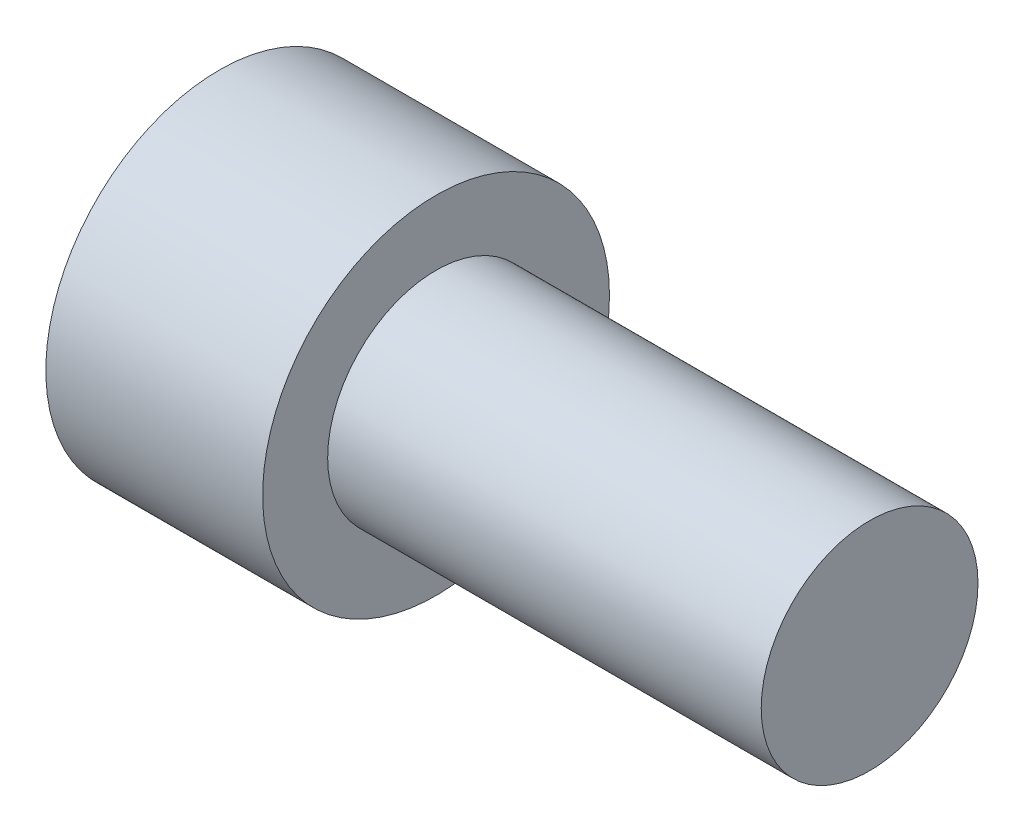
ISO-10303-21;
HEADER;
FILE_DESCRIPTION(('STEP AP214'),'2;1');
FILE_NAME('part.step','',(''),(''),'','','');
FILE_SCHEMA(('AUTOMOTIVE_DESIGN { 1 0 10303 214 1 1 1 1 }'));
ENDSEC;
DATA;
#1=APPLICATION_CONTEXT('core data for automotive mechanical design processes');
#2=APPLICATION_PROTOCOL_DEFINITION('international standard','automotive_design',2000,#1);
#3=PRODUCT_CONTEXT('',#1,'mechanical');
#4=PRODUCT('Part','Part','',(#3));
#5=PRODUCT_RELATED_PRODUCT_CATEGORY('part','',(#4));
#6=PRODUCT_DEFINITION_FORMATION('','',#4);
#7=PRODUCT_DEFINITION_CONTEXT('part definition',#1,'design');
#8=PRODUCT_DEFINITION('design','',#6,#7);
#9=PRODUCT_DEFINITION_SHAPE('','',#8);
#10=(LENGTH_UNIT() NAMED_UNIT(*) SI_UNIT(.MILLI.,.METRE.));
#11=(NAMED_UNIT(*) PLANE_ANGLE_UNIT() SI_UNIT($,.RADIAN.));
#12=(NAMED_UNIT(*) SI_UNIT($,.STERADIAN.) SOLID_ANGLE_UNIT());
#13=UNCERTAINTY_MEASURE_WITH_UNIT(LENGTH_MEASURE(1.E-05),#10,'distance_accuracy_value','');
#14=(GEOMETRIC_REPRESENTATION_CONTEXT(3) GLOBAL_UNCERTAINTY_ASSIGNED_CONTEXT((#13)) GLOBAL_UNIT_ASSIGNED_CONTEXT((#10,
#11,#12)) REPRESENTATION_CONTEXT('',''));
#15=CARTESIAN_POINT('',(0.,0.,0.));
#16=DIRECTION('',(0.,0.,1.));
#17=DIRECTION('',(1.,0.,0.));
#18=AXIS2_PLACEMENT_3D('',#15,#16,#17);
#19=CARTESIAN_POINT('',(10.,0.,0.));
#20=DIRECTION('',(-1.,0.,0.));
#21=DIRECTION('',(0.,0.,1.));
#22=AXIS2_PLACEMENT_3D('',#19,#20,#21);
#23=CYLINDRICAL_SURFACE('',#22,8.);
#24=CARTESIAN_POINT('',(10.,0.,0.));
#25=DIRECTION('',(1.,0.,0.));
#26=DIRECTION('',(0.,0.,-1.));
#27=AXIS2_PLACEMENT_3D('',#24,#25,#26);
#28=CIRCLE('',#27,8.);
#29=CARTESIAN_POINT('',(10.,0.,-8.));
#30=VERTEX_POINT('',#29);
#31=EDGE_CURVE('E39',#30,#30,#28,.T.);
#32=ORIENTED_EDGE('',*,*,#31,.F.);
#33=EDGE_LOOP('',(#32));
#34=FACE_BOUND('',#33,.T.);
#35=CARTESIAN_POINT('',(0.,0.,0.));
#36=DIRECTION('',(1.,0.,0.));
#37=DIRECTION('',(0.,0.,-1.));
#38=AXIS2_PLACEMENT_3D('',#35,#36,#37);
#39=CIRCLE('',#38,8.);
#40=CARTESIAN_POINT('',(0.,0.,-8.));
#41=VERTEX_POINT('',#40);
#42=EDGE_CURVE('E35',#41,#41,#39,.T.);
#43=ORIENTED_EDGE('',*,*,#42,.T.);
#44=EDGE_LOOP('',(#43));
#45=FACE_BOUND('',#44,.T.);
#46=ADVANCED_FACE('F32',(#34,#45),#23,.T.);
#47=CARTESIAN_POINT('',(10.,0.,0.));
#48=DIRECTION('',(1.,0.,0.));
#49=DIRECTION('',(0.,0.,-1.));
#50=AXIS2_PLACEMENT_3D('',#47,#48,#49);
#51=PLANE('',#50);
#52=CARTESIAN_POINT('',(10.,0.,0.));
#53=DIRECTION('',(1.,0.,0.));
#54=DIRECTION('',(0.,0.,-1.));
#55=AXIS2_PLACEMENT_3D('',#52,#53,#54);
#56=CIRCLE('',#55,5.);
#57=CARTESIAN_POINT('',(10.,0.,-5.));
#58=VERTEX_POINT('',#57);
#59=EDGE_CURVE('E10',#58,#58,#56,.T.);
#60=ORIENTED_EDGE('',*,*,#59,.F.);
#61=EDGE_LOOP('',(#60));
#62=FACE_BOUND('',#61,.T.);
#63=ORIENTED_EDGE('',*,*,#31,.T.);
#64=EDGE_LOOP('',(#63));
#65=FACE_BOUND('',#64,.T.);
#66=ADVANCED_FACE('F56',(#62,#65),#51,.T.);
#67=CARTESIAN_POINT('',(0.,0.,0.));
#68=DIRECTION('',(1.,0.,0.));
#69=DIRECTION('',(0.,0.,-1.));
#70=AXIS2_PLACEMENT_3D('',#67,#68,#69);
#71=PLANE('',#70);
#72=ORIENTED_EDGE('',*,*,#42,.F.);
#73=EDGE_LOOP('',(#72));
#74=FACE_BOUND('',#73,.T.);
#75=ADVANCED_FACE('F53',(#74),#71,.F.);
#76=CARTESIAN_POINT('',(30.,0.,0.));
#77=DIRECTION('',(-1.,0.,0.));
#78=DIRECTION('',(0.,0.,1.));
#79=AXIS2_PLACEMENT_3D('',#76,#77,#78);
#80=CYLINDRICAL_SURFACE('',#79,5.);
#81=CARTESIAN_POINT('',(30.,0.,0.));
#82=DIRECTION('',(1.,0.,0.));
#83=DIRECTION('',(0.,0.,-1.));
#84=AXIS2_PLACEMENT_3D('',#81,#82,#83);
#85=CIRCLE('',#84,5.);
#86=CARTESIAN_POINT('',(30.,0.,-5.));
#87=VERTEX_POINT('',#86);
#88=EDGE_CURVE('E45',#87,#87,#85,.T.);
#89=ORIENTED_EDGE('',*,*,#88,.F.);
#90=EDGE_LOOP('',(#89));
#91=FACE_BOUND('',#90,.T.);
#92=ORIENTED_EDGE('',*,*,#59,.T.);
#93=EDGE_LOOP('',(#92));
#94=FACE_BOUND('',#93,.T.);
#95=ADVANCED_FACE('F55',(#91,#94),#80,.T.);
#96=CARTESIAN_POINT('',(30.,0.,0.));
#97=DIRECTION('',(1.,0.,0.));
#98=DIRECTION('',(0.,0.,-1.));
#99=AXIS2_PLACEMENT_3D('',#96,#97,#98);
#100=PLANE('',#99);
#101=ORIENTED_EDGE('',*,*,#88,.T.);
#102=EDGE_LOOP('',(#101));
#103=FACE_BOUND('',#102,.T.);
#104=ADVANCED_FACE('F61',(#103),#100,.T.);
#105=CLOSED_SHELL('',(#46,#66,#75,#95,#104));
#106=MANIFOLD_SOLID_BREP('B2',#105);
#107=ADVANCED_BREP_SHAPE_REPRESENTATION('',(#18,#106),#14);
#108=SHAPE_DEFINITION_REPRESENTATION(#9,#107);
ENDSEC;
END-ISO-10303-21;
